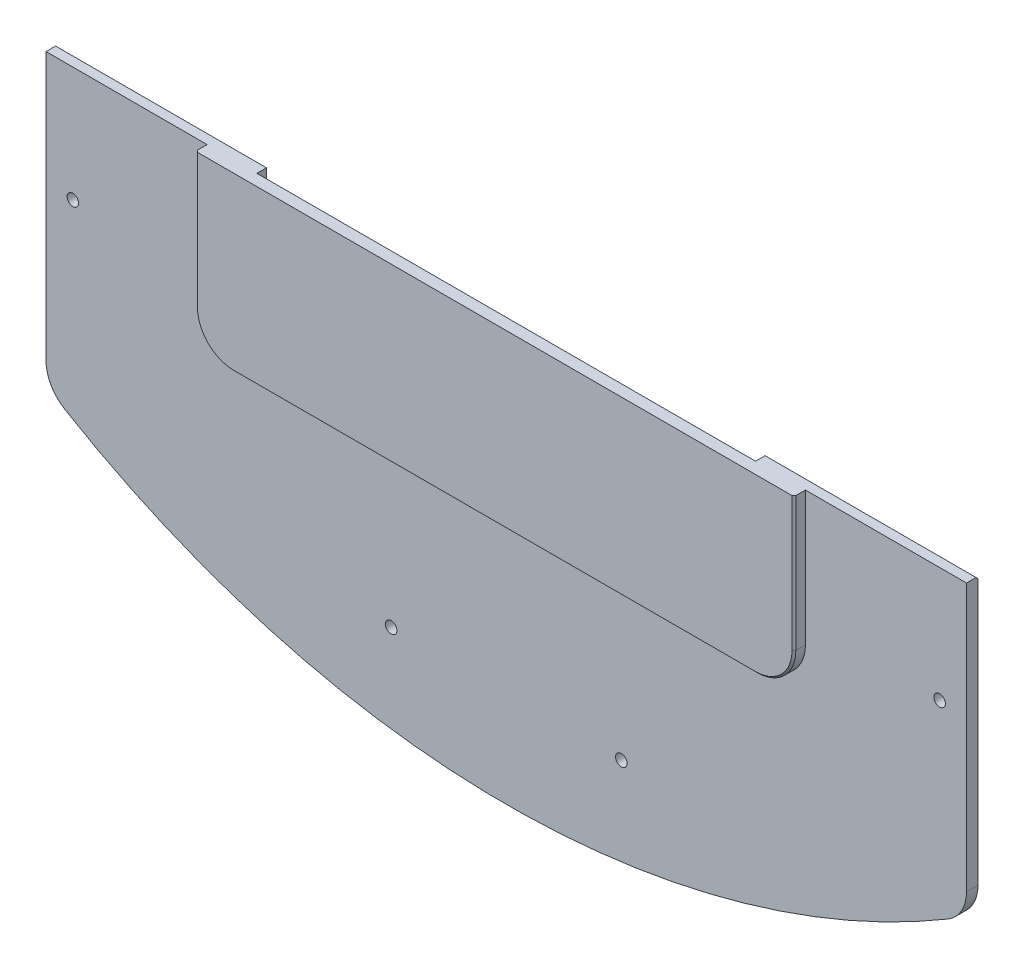
ISO-10303-21;
HEADER;
FILE_DESCRIPTION(('STEP AP214'),'2;1');
FILE_NAME('part.step','',(''),(''),'','','');
FILE_SCHEMA(('AUTOMOTIVE_DESIGN { 1 0 10303 214 1 1 1 1 }'));
ENDSEC;
DATA;
#1=APPLICATION_CONTEXT('core data for automotive mechanical design processes');
#2=APPLICATION_PROTOCOL_DEFINITION('international standard','automotive_design',2000,#1);
#3=PRODUCT_CONTEXT('',#1,'mechanical');
#4=PRODUCT('Part','Part','',(#3));
#5=PRODUCT_RELATED_PRODUCT_CATEGORY('part','',(#4));
#6=PRODUCT_DEFINITION_FORMATION('','',#4);
#7=PRODUCT_DEFINITION_CONTEXT('part definition',#1,'design');
#8=PRODUCT_DEFINITION('design','',#6,#7);
#9=PRODUCT_DEFINITION_SHAPE('','',#8);
#10=(LENGTH_UNIT() NAMED_UNIT(*) SI_UNIT(.MILLI.,.METRE.));
#11=(NAMED_UNIT(*) PLANE_ANGLE_UNIT() SI_UNIT($,.RADIAN.));
#12=(NAMED_UNIT(*) SI_UNIT($,.STERADIAN.) SOLID_ANGLE_UNIT());
#13=UNCERTAINTY_MEASURE_WITH_UNIT(LENGTH_MEASURE(1.E-05),#10,'distance_accuracy_value','');
#14=(GEOMETRIC_REPRESENTATION_CONTEXT(3) GLOBAL_UNCERTAINTY_ASSIGNED_CONTEXT((#13)) GLOBAL_UNIT_ASSIGNED_CONTEXT((#10,
#11,#12)) REPRESENTATION_CONTEXT('',''));
#15=CARTESIAN_POINT('',(0.,0.,0.));
#16=DIRECTION('',(0.,0.,1.));
#17=DIRECTION('',(1.,0.,0.));
#18=AXIS2_PLACEMENT_3D('',#15,#16,#17);
#19=CARTESIAN_POINT('',(-120.,-15.,3.));
#20=DIRECTION('',(1.,0.,0.));
#21=DIRECTION('',(0.,1.,0.));
#22=AXIS2_PLACEMENT_3D('',#19,#20,#21);
#23=PLANE('',#22);
#24=DIRECTION('',(0.,0.,-1.));
#25=VECTOR('',#24,1.);
#26=CARTESIAN_POINT('',(-120.,-15.,3.));
#27=LINE('',#26,#25);
#28=CARTESIAN_POINT('',(-120.,-15.,3.));
#29=VERTEX_POINT('',#28);
#30=CARTESIAN_POINT('',(-120.,-15.,0.499999999999973));
#31=VERTEX_POINT('',#30);
#32=EDGE_CURVE('E319',#29,#31,#27,.T.);
#33=ORIENTED_EDGE('',*,*,#32,.T.);
#34=DIRECTION('',(0.,0.707106781186548,0.707106781186548));
#35=VECTOR('',#34,1.);
#36=CARTESIAN_POINT('',(-120.,-15.,0.499999999999973));
#37=LINE('',#36,#35);
#38=CARTESIAN_POINT('',(-120.,-15.5,0.));
#39=VERTEX_POINT('',#38);
#40=EDGE_CURVE('E388',#31,#39,#37,.F.);
#41=ORIENTED_EDGE('',*,*,#40,.T.);
#42=DIRECTION('',(0.,-1.,0.));
#43=VECTOR('',#42,1.);
#44=CARTESIAN_POINT('',(-120.,-15.,0.));
#45=LINE('',#44,#43);
#46=CARTESIAN_POINT('',(-120.,-84.7295320191116,0.));
#47=VERTEX_POINT('',#46);
#48=EDGE_CURVE('E301',#39,#47,#45,.T.);
#49=ORIENTED_EDGE('',*,*,#48,.T.);
#50=DIRECTION('',(0.,0.,-1.));
#51=VECTOR('',#50,1.);
#52=CARTESIAN_POINT('',(-120.,-84.7295320191116,3.));
#53=LINE('',#52,#51);
#54=CARTESIAN_POINT('',(-120.,-84.7295320191116,3.));
#55=VERTEX_POINT('',#54);
#56=EDGE_CURVE('E360',#47,#55,#53,.F.);
#57=ORIENTED_EDGE('',*,*,#56,.T.);
#58=DIRECTION('',(0.,-1.,0.));
#59=VECTOR('',#58,1.);
#60=CARTESIAN_POINT('',(-120.,-15.,3.));
#61=LINE('',#60,#59);
#62=EDGE_CURVE('E302',#29,#55,#61,.T.);
#63=ORIENTED_EDGE('',*,*,#62,.F.);
#64=EDGE_LOOP('',(#33,#41,#49,#57,#63));
#65=FACE_BOUND('',#64,.T.);
#66=ADVANCED_FACE('F47',(#65),#23,.F.);
#67=CARTESIAN_POINT('',(0.,100.,3.));
#68=DIRECTION('',(0.,0.,-1.));
#69=DIRECTION('',(-1.,0.,0.));
#70=AXIS2_PLACEMENT_3D('',#67,#68,#69);
#71=CYLINDRICAL_SURFACE('',#70,225.);
#72=CARTESIAN_POINT('',(0.,100.,0.));
#73=DIRECTION('',(0.,0.,1.));
#74=DIRECTION('',(1.,0.,0.));
#75=AXIS2_PLACEMENT_3D('',#72,#73,#74);
#76=CIRCLE('',#75,225.);
#77=CARTESIAN_POINT('',(-115.116279069767,-93.3216032758145,0.));
#78=VERTEX_POINT('',#77);
#79=CARTESIAN_POINT('',(115.116279069767,-93.3216032758145,0.));
#80=VERTEX_POINT('',#79);
#81=EDGE_CURVE('E322',#78,#80,#76,.T.);
#82=ORIENTED_EDGE('',*,*,#81,.T.);
#83=DIRECTION('',(0.,0.,-1.));
#84=VECTOR('',#83,1.);
#85=CARTESIAN_POINT('',(115.116279069767,-93.3216032758145,3.));
#86=LINE('',#85,#84);
#87=CARTESIAN_POINT('',(115.116279069767,-93.3216032758145,3.));
#88=VERTEX_POINT('',#87);
#89=EDGE_CURVE('E351',#80,#88,#86,.F.);
#90=ORIENTED_EDGE('',*,*,#89,.T.);
#91=CARTESIAN_POINT('',(0.,100.,3.));
#92=DIRECTION('',(0.,0.,1.));
#93=DIRECTION('',(1.,0.,0.));
#94=AXIS2_PLACEMENT_3D('',#91,#92,#93);
#95=CIRCLE('',#94,225.);
#96=CARTESIAN_POINT('',(-115.116279069767,-93.3216032758145,3.));
#97=VERTEX_POINT('',#96);
#98=EDGE_CURVE('E306',#97,#88,#95,.T.);
#99=ORIENTED_EDGE('',*,*,#98,.F.);
#100=DIRECTION('',(0.,0.,-1.));
#101=VECTOR('',#100,1.);
#102=CARTESIAN_POINT('',(-115.116279069767,-93.3216032758145,3.));
#103=LINE('',#102,#101);
#104=EDGE_CURVE('E347',#97,#78,#103,.T.);
#105=ORIENTED_EDGE('',*,*,#104,.T.);
#106=EDGE_LOOP('',(#82,#90,#99,#105));
#107=FACE_BOUND('',#106,.T.);
#108=ADVANCED_FACE('F561',(#107),#71,.T.);
#109=CARTESIAN_POINT('',(120.,-15.,3.));
#110=DIRECTION('',(-1.,0.,0.));
#111=DIRECTION('',(0.,-1.,0.));
#112=AXIS2_PLACEMENT_3D('',#109,#110,#111);
#113=PLANE('',#112);
#114=DIRECTION('',(0.,1.,0.));
#115=VECTOR('',#114,1.);
#116=CARTESIAN_POINT('',(120.,-15.,0.));
#117=LINE('',#116,#115);
#118=CARTESIAN_POINT('',(120.,-84.7295320191116,0.));
#119=VERTEX_POINT('',#118);
#120=CARTESIAN_POINT('',(120.,-15.5,0.));
#121=VERTEX_POINT('',#120);
#122=EDGE_CURVE('E307',#119,#121,#117,.T.);
#123=ORIENTED_EDGE('',*,*,#122,.T.);
#124=DIRECTION('',(0.,-0.707106781186548,-0.707106781186548));
#125=VECTOR('',#124,1.);
#126=CARTESIAN_POINT('',(120.,-15.,0.499999999999995));
#127=LINE('',#126,#125);
#128=CARTESIAN_POINT('',(120.,-15.,0.499999999999973));
#129=VERTEX_POINT('',#128);
#130=EDGE_CURVE('E385',#121,#129,#127,.F.);
#131=ORIENTED_EDGE('',*,*,#130,.T.);
#132=DIRECTION('',(0.,0.,-1.));
#133=VECTOR('',#132,1.);
#134=CARTESIAN_POINT('',(120.,-15.,3.));
#135=LINE('',#134,#133);
#136=CARTESIAN_POINT('',(120.,-15.,3.));
#137=VERTEX_POINT('',#136);
#138=EDGE_CURVE('E332',#137,#129,#135,.T.);
#139=ORIENTED_EDGE('',*,*,#138,.F.);
#140=DIRECTION('',(0.,1.,0.));
#141=VECTOR('',#140,1.);
#142=CARTESIAN_POINT('',(120.,-15.,3.));
#143=LINE('',#142,#141);
#144=CARTESIAN_POINT('',(120.,-84.7295320191116,3.));
#145=VERTEX_POINT('',#144);
#146=EDGE_CURVE('E311',#145,#137,#143,.T.);
#147=ORIENTED_EDGE('',*,*,#146,.F.);
#148=DIRECTION('',(0.,0.,-1.));
#149=VECTOR('',#148,1.);
#150=CARTESIAN_POINT('',(120.,-84.7295320191116,3.));
#151=LINE('',#150,#149);
#152=EDGE_CURVE('E336',#145,#119,#151,.T.);
#153=ORIENTED_EDGE('',*,*,#152,.T.);
#154=EDGE_LOOP('',(#123,#131,#139,#147,#153));
#155=FACE_BOUND('',#154,.T.);
#156=ADVANCED_FACE('F567',(#155),#113,.F.);
#157=CARTESIAN_POINT('',(-120.,-15.,3.));
#158=DIRECTION('',(0.,-1.,0.));
#159=DIRECTION('',(0.,0.,-1.));
#160=AXIS2_PLACEMENT_3D('',#157,#158,#159);
#161=PLANE('',#160);
#162=DIRECTION('',(-1.,0.,0.));
#163=VECTOR('',#162,1.);
#164=CARTESIAN_POINT('',(-78.,-15.,6.));
#165=LINE('',#164,#163);
#166=CARTESIAN_POINT('',(77.5,-15.,6.));
#167=VERTEX_POINT('',#166);
#168=CARTESIAN_POINT('',(-77.5,-15.,6.));
#169=VERTEX_POINT('',#168);
#170=EDGE_CURVE('E280',#167,#169,#165,.T.);
#171=ORIENTED_EDGE('',*,*,#170,.F.);
#172=DIRECTION('',(0.70710678118654,0.,-0.707106781186555));
#173=VECTOR('',#172,1.);
#174=CARTESIAN_POINT('',(77.5,-15.,6.));
#175=LINE('',#174,#173);
#176=CARTESIAN_POINT('',(78.,-15.,5.49999999999999));
#177=VERTEX_POINT('',#176);
#178=EDGE_CURVE('E446',#167,#177,#175,.T.);
#179=ORIENTED_EDGE('',*,*,#178,.T.);
#180=DIRECTION('',(0.,0.,-1.));
#181=VECTOR('',#180,1.);
#182=CARTESIAN_POINT('',(78.,-15.,6.));
#183=LINE('',#182,#181);
#184=CARTESIAN_POINT('',(78.,-15.,3.));
#185=VERTEX_POINT('',#184);
#186=EDGE_CURVE('E298',#177,#185,#183,.T.);
#187=ORIENTED_EDGE('',*,*,#186,.T.);
#188=DIRECTION('',(-1.,0.,0.));
#189=VECTOR('',#188,1.);
#190=CARTESIAN_POINT('',(-120.,-15.,3.));
#191=LINE('',#190,#189);
#192=EDGE_CURVE('E315',#137,#185,#191,.T.);
#193=ORIENTED_EDGE('',*,*,#192,.F.);
#194=ORIENTED_EDGE('',*,*,#138,.T.);
#195=DIRECTION('',(-1.,0.,0.));
#196=VECTOR('',#195,1.);
#197=CARTESIAN_POINT('',(-120.,-15.,0.499999999999973));
#198=LINE('',#197,#196);
#199=CARTESIAN_POINT('',(65.,-15.,0.499999999999973));
#200=VERTEX_POINT('',#199);
#201=EDGE_CURVE('E366',#129,#200,#198,.T.);
#202=ORIENTED_EDGE('',*,*,#201,.T.);
#203=DIRECTION('',(0.,0.,-1.));
#204=VECTOR('',#203,1.);
#205=CARTESIAN_POINT('',(65.,-15.,3.));
#206=LINE('',#205,#204);
#207=CARTESIAN_POINT('',(65.,-15.,3.));
#208=VERTEX_POINT('',#207);
#209=EDGE_CURVE('E238',#208,#200,#206,.T.);
#210=ORIENTED_EDGE('',*,*,#209,.F.);
#211=DIRECTION('',(1.,0.,0.));
#212=VECTOR('',#211,1.);
#213=CARTESIAN_POINT('',(65.,-15.,3.));
#214=LINE('',#213,#212);
#215=CARTESIAN_POINT('',(-65.,-15.,3.));
#216=VERTEX_POINT('',#215);
#217=EDGE_CURVE('E211',#216,#208,#214,.T.);
#218=ORIENTED_EDGE('',*,*,#217,.F.);
#219=DIRECTION('',(0.,0.,-1.));
#220=VECTOR('',#219,1.);
#221=CARTESIAN_POINT('',(-65.,-15.,3.));
#222=LINE('',#221,#220);
#223=CARTESIAN_POINT('',(-65.,-15.,0.499999999999973));
#224=VERTEX_POINT('',#223);
#225=EDGE_CURVE('E242',#216,#224,#222,.T.);
#226=ORIENTED_EDGE('',*,*,#225,.T.);
#227=DIRECTION('',(-1.,0.,0.));
#228=VECTOR('',#227,1.);
#229=CARTESIAN_POINT('',(-120.,-15.,0.499999999999973));
#230=LINE('',#229,#228);
#231=EDGE_CURVE('E363',#224,#31,#230,.T.);
#232=ORIENTED_EDGE('',*,*,#231,.T.);
#233=ORIENTED_EDGE('',*,*,#32,.F.);
#234=CARTESIAN_POINT('',(-78.,-15.,3.));
#235=VERTEX_POINT('',#234);
#236=EDGE_CURVE('E314',#235,#29,#191,.T.);
#237=ORIENTED_EDGE('',*,*,#236,.F.);
#238=DIRECTION('',(0.,0.,-1.));
#239=VECTOR('',#238,1.);
#240=CARTESIAN_POINT('',(-78.,-15.,6.));
#241=LINE('',#240,#239);
#242=CARTESIAN_POINT('',(-78.,-15.,5.49999999999999));
#243=VERTEX_POINT('',#242);
#244=EDGE_CURVE('E284',#243,#235,#241,.T.);
#245=ORIENTED_EDGE('',*,*,#244,.F.);
#246=DIRECTION('',(0.707106781186537,0.,0.707106781186558));
#247=VECTOR('',#246,1.);
#248=CARTESIAN_POINT('',(-77.5,-15.,6.));
#249=LINE('',#248,#247);
#250=EDGE_CURVE('E443',#243,#169,#249,.T.);
#251=ORIENTED_EDGE('',*,*,#250,.T.);
#252=EDGE_LOOP('',(#171,#179,#187,#193,#194,#202,#210,#218,#226,#232,#233,#237,#245,#251));
#253=FACE_BOUND('',#252,.T.);
#254=ADVANCED_FACE('F490',(#253),#161,.F.);
#255=CARTESIAN_POINT('',(0.,100.,3.));
#256=DIRECTION('',(0.,0.,1.));
#257=DIRECTION('',(1.,0.,0.));
#258=AXIS2_PLACEMENT_3D('',#255,#256,#257);
#259=PLANE('',#258);
#260=CARTESIAN_POINT('',(30.,-100.,3.));
#261=DIRECTION('',(0.,0.,-1.));
#262=DIRECTION('',(1.,0.,0.));
#263=AXIS2_PLACEMENT_3D('',#260,#261,#262);
#264=CIRCLE('',#263,1.5);
#265=CARTESIAN_POINT('',(31.5,-100.,3.));
#266=VERTEX_POINT('',#265);
#267=EDGE_CURVE('E241',#266,#266,#264,.T.);
#268=ORIENTED_EDGE('',*,*,#267,.T.);
#269=EDGE_LOOP('',(#268));
#270=FACE_BOUND('',#269,.T.);
#271=CARTESIAN_POINT('',(113.,-45.,3.));
#272=DIRECTION('',(0.,0.,-1.));
#273=DIRECTION('',(1.,0.,0.));
#274=AXIS2_PLACEMENT_3D('',#271,#272,#273);
#275=CIRCLE('',#274,1.5);
#276=CARTESIAN_POINT('',(114.5,-45.,3.));
#277=VERTEX_POINT('',#276);
#278=EDGE_CURVE('E261',#277,#277,#275,.T.);
#279=ORIENTED_EDGE('',*,*,#278,.T.);
#280=EDGE_LOOP('',(#279));
#281=FACE_BOUND('',#280,.T.);
#282=CARTESIAN_POINT('',(-113.,-45.,3.));
#283=DIRECTION('',(0.,0.,-1.));
#284=DIRECTION('',(-1.,0.,0.));
#285=AXIS2_PLACEMENT_3D('',#282,#283,#284);
#286=CIRCLE('',#285,1.5);
#287=CARTESIAN_POINT('',(-114.5,-45.,3.));
#288=VERTEX_POINT('',#287);
#289=EDGE_CURVE('E253',#288,#288,#286,.T.);
#290=ORIENTED_EDGE('',*,*,#289,.T.);
#291=EDGE_LOOP('',(#290));
#292=FACE_BOUND('',#291,.T.);
#293=CARTESIAN_POINT('',(-30.,-100.,3.));
#294=DIRECTION('',(0.,0.,-1.));
#295=DIRECTION('',(-1.,0.,0.));
#296=AXIS2_PLACEMENT_3D('',#293,#294,#295);
#297=CIRCLE('',#296,1.50000000000002);
#298=CARTESIAN_POINT('',(-31.5,-100.,3.));
#299=VERTEX_POINT('',#298);
#300=EDGE_CURVE('E272',#299,#299,#297,.T.);
#301=ORIENTED_EDGE('',*,*,#300,.T.);
#302=EDGE_LOOP('',(#301));
#303=FACE_BOUND('',#302,.T.);
#304=ORIENTED_EDGE('',*,*,#98,.T.);
#305=CARTESIAN_POINT('',(110.,-84.7295320191116,3.));
#306=DIRECTION('',(0.,0.,1.));
#307=DIRECTION('',(1.,0.,0.));
#308=AXIS2_PLACEMENT_3D('',#305,#306,#307);
#309=CIRCLE('',#308,10.);
#310=EDGE_CURVE('E357',#88,#145,#309,.T.);
#311=ORIENTED_EDGE('',*,*,#310,.T.);
#312=ORIENTED_EDGE('',*,*,#146,.T.);
#313=ORIENTED_EDGE('',*,*,#192,.T.);
#314=DIRECTION('',(0.,1.,0.));
#315=VECTOR('',#314,1.);
#316=CARTESIAN_POINT('',(78.,-15.,3.));
#317=LINE('',#316,#315);
#318=CARTESIAN_POINT('',(78.,-50.,3.));
#319=VERTEX_POINT('',#318);
#320=EDGE_CURVE('E285',#319,#185,#317,.T.);
#321=ORIENTED_EDGE('',*,*,#320,.F.);
#322=CARTESIAN_POINT('',(68.,-50.,3.));
#323=DIRECTION('',(0.,0.,1.));
#324=DIRECTION('',(1.,0.,0.));
#325=AXIS2_PLACEMENT_3D('',#322,#323,#324);
#326=CIRCLE('',#325,10.);
#327=CARTESIAN_POINT('',(68.,-60.,3.));
#328=VERTEX_POINT('',#327);
#329=EDGE_CURVE('E424',#319,#328,#326,.F.);
#330=ORIENTED_EDGE('',*,*,#329,.T.);
#331=DIRECTION('',(1.,0.,0.));
#332=VECTOR('',#331,1.);
#333=CARTESIAN_POINT('',(-78.,-60.,3.));
#334=LINE('',#333,#332);
#335=CARTESIAN_POINT('',(-68.,-60.,3.));
#336=VERTEX_POINT('',#335);
#337=EDGE_CURVE('E289',#336,#328,#334,.T.);
#338=ORIENTED_EDGE('',*,*,#337,.F.);
#339=CARTESIAN_POINT('',(-68.,-50.,3.));
#340=DIRECTION('',(0.,0.,1.));
#341=DIRECTION('',(1.,0.,0.));
#342=AXIS2_PLACEMENT_3D('',#339,#340,#341);
#343=CIRCLE('',#342,10.);
#344=CARTESIAN_POINT('',(-78.,-50.,3.));
#345=VERTEX_POINT('',#344);
#346=EDGE_CURVE('E421',#336,#345,#343,.F.);
#347=ORIENTED_EDGE('',*,*,#346,.T.);
#348=DIRECTION('',(0.,-1.,0.));
#349=VECTOR('',#348,1.);
#350=CARTESIAN_POINT('',(-78.,-15.,3.));
#351=LINE('',#350,#349);
#352=EDGE_CURVE('E276',#235,#345,#351,.T.);
#353=ORIENTED_EDGE('',*,*,#352,.F.);
#354=ORIENTED_EDGE('',*,*,#236,.T.);
#355=ORIENTED_EDGE('',*,*,#62,.T.);
#356=CARTESIAN_POINT('',(-110.,-84.7295320191116,3.));
#357=DIRECTION('',(0.,0.,1.));
#358=DIRECTION('',(1.,0.,0.));
#359=AXIS2_PLACEMENT_3D('',#356,#357,#358);
#360=CIRCLE('',#359,10.);
#361=EDGE_CURVE('E354',#55,#97,#360,.T.);
#362=ORIENTED_EDGE('',*,*,#361,.T.);
#363=EDGE_LOOP('',(#304,#311,#312,#313,#321,#330,#338,#347,#353,#354,#355,#362));
#364=FACE_BOUND('',#363,.T.);
#365=ADVANCED_FACE('F495',(#270,#281,#292,#303,#364),#259,.T.);
#366=CARTESIAN_POINT('',(0.,100.,0.));
#367=DIRECTION('',(0.,0.,1.));
#368=DIRECTION('',(1.,0.,0.));
#369=AXIS2_PLACEMENT_3D('',#366,#367,#368);
#370=PLANE('',#369);
#371=CARTESIAN_POINT('',(30.,-100.,0.));
#372=DIRECTION('',(0.,0.,-1.));
#373=DIRECTION('',(1.,0.,0.));
#374=AXIS2_PLACEMENT_3D('',#371,#372,#373);
#375=CIRCLE('',#374,1.5);
#376=CARTESIAN_POINT('',(31.5,-100.,0.));
#377=VERTEX_POINT('',#376);
#378=EDGE_CURVE('E265',#377,#377,#375,.T.);
#379=ORIENTED_EDGE('',*,*,#378,.F.);
#380=EDGE_LOOP('',(#379));
#381=FACE_BOUND('',#380,.T.);
#382=CARTESIAN_POINT('',(113.,-45.,0.));
#383=DIRECTION('',(0.,0.,-1.));
#384=DIRECTION('',(1.,0.,0.));
#385=AXIS2_PLACEMENT_3D('',#382,#383,#384);
#386=CIRCLE('',#385,1.5);
#387=CARTESIAN_POINT('',(114.5,-45.,0.));
#388=VERTEX_POINT('',#387);
#389=EDGE_CURVE('E257',#388,#388,#386,.T.);
#390=ORIENTED_EDGE('',*,*,#389,.F.);
#391=EDGE_LOOP('',(#390));
#392=FACE_BOUND('',#391,.T.);
#393=CARTESIAN_POINT('',(-113.,-45.,0.));
#394=DIRECTION('',(0.,0.,-1.));
#395=DIRECTION('',(-1.,0.,0.));
#396=AXIS2_PLACEMENT_3D('',#393,#394,#395);
#397=CIRCLE('',#396,1.5);
#398=CARTESIAN_POINT('',(-114.5,-45.,0.));
#399=VERTEX_POINT('',#398);
#400=EDGE_CURVE('E248',#399,#399,#397,.T.);
#401=ORIENTED_EDGE('',*,*,#400,.F.);
#402=EDGE_LOOP('',(#401));
#403=FACE_BOUND('',#402,.T.);
#404=CARTESIAN_POINT('',(-30.,-100.,0.));
#405=DIRECTION('',(0.,0.,-1.));
#406=DIRECTION('',(-1.,0.,0.));
#407=AXIS2_PLACEMENT_3D('',#404,#405,#406);
#408=CIRCLE('',#407,1.50000000000002);
#409=CARTESIAN_POINT('',(-31.5,-100.,0.));
#410=VERTEX_POINT('',#409);
#411=EDGE_CURVE('E252',#410,#410,#408,.T.);
#412=ORIENTED_EDGE('',*,*,#411,.F.);
#413=EDGE_LOOP('',(#412));
#414=FACE_BOUND('',#413,.T.);
#415=DIRECTION('',(0.,1.,0.));
#416=VECTOR('',#415,1.);
#417=CARTESIAN_POINT('',(65.5,100.,0.));
#418=LINE('',#417,#416);
#419=CARTESIAN_POINT('',(65.5,-35.5,0.));
#420=VERTEX_POINT('',#419);
#421=CARTESIAN_POINT('',(65.5,-15.5,0.));
#422=VERTEX_POINT('',#421);
#423=EDGE_CURVE('E373',#420,#422,#418,.T.);
#424=ORIENTED_EDGE('',*,*,#423,.T.);
#425=DIRECTION('',(1.,0.,0.));
#426=VECTOR('',#425,1.);
#427=CARTESIAN_POINT('',(0.,-15.5,0.));
#428=LINE('',#427,#426);
#429=EDGE_CURVE('E382',#422,#121,#428,.T.);
#430=ORIENTED_EDGE('',*,*,#429,.T.);
#431=ORIENTED_EDGE('',*,*,#122,.F.);
#432=CARTESIAN_POINT('',(110.,-84.7295320191116,0.));
#433=DIRECTION('',(0.,0.,1.));
#434=DIRECTION('',(1.,0.,0.));
#435=AXIS2_PLACEMENT_3D('',#432,#433,#434);
#436=CIRCLE('',#435,10.);
#437=EDGE_CURVE('E344',#119,#80,#436,.F.);
#438=ORIENTED_EDGE('',*,*,#437,.T.);
#439=ORIENTED_EDGE('',*,*,#81,.F.);
#440=CARTESIAN_POINT('',(-110.,-84.7295320191116,0.));
#441=DIRECTION('',(0.,0.,1.));
#442=DIRECTION('',(1.,0.,0.));
#443=AXIS2_PLACEMENT_3D('',#440,#441,#442);
#444=CIRCLE('',#443,10.);
#445=EDGE_CURVE('E340',#78,#47,#444,.F.);
#446=ORIENTED_EDGE('',*,*,#445,.T.);
#447=ORIENTED_EDGE('',*,*,#48,.F.);
#448=DIRECTION('',(1.,0.,0.));
#449=VECTOR('',#448,1.);
#450=CARTESIAN_POINT('',(0.,-15.5,0.));
#451=LINE('',#450,#449);
#452=CARTESIAN_POINT('',(-65.5,-15.5,0.));
#453=VERTEX_POINT('',#452);
#454=EDGE_CURVE('E379',#39,#453,#451,.T.);
#455=ORIENTED_EDGE('',*,*,#454,.T.);
#456=DIRECTION('',(0.,-1.,0.));
#457=VECTOR('',#456,1.);
#458=CARTESIAN_POINT('',(-65.5000000000001,100.,0.));
#459=LINE('',#458,#457);
#460=CARTESIAN_POINT('',(-65.5,-35.5,0.));
#461=VERTEX_POINT('',#460);
#462=EDGE_CURVE('E376',#453,#461,#459,.T.);
#463=ORIENTED_EDGE('',*,*,#462,.T.);
#464=DIRECTION('',(1.,0.,0.));
#465=VECTOR('',#464,1.);
#466=CARTESIAN_POINT('',(0.,-35.5,0.));
#467=LINE('',#466,#465);
#468=EDGE_CURVE('E370',#461,#420,#467,.T.);
#469=ORIENTED_EDGE('',*,*,#468,.T.);
#470=EDGE_LOOP('',(#424,#430,#431,#438,#439,#446,#447,#455,#463,#469));
#471=FACE_BOUND('',#470,.T.);
#472=ADVANCED_FACE('F570',(#381,#392,#403,#414,#471),#370,.F.);
#473=CARTESIAN_POINT('',(-78.,-15.,6.));
#474=DIRECTION('',(1.,0.,0.));
#475=DIRECTION('',(0.,1.,0.));
#476=AXIS2_PLACEMENT_3D('',#473,#474,#475);
#477=PLANE('',#476);
#478=DIRECTION('',(0.,0.,-1.));
#479=VECTOR('',#478,1.);
#480=CARTESIAN_POINT('',(-78.,-50.,6.));
#481=LINE('',#480,#479);
#482=CARTESIAN_POINT('',(-78.,-50.,5.49999999999999));
#483=VERTEX_POINT('',#482);
#484=EDGE_CURVE('E415',#345,#483,#481,.F.);
#485=ORIENTED_EDGE('',*,*,#484,.T.);
#486=DIRECTION('',(0.,1.,0.));
#487=VECTOR('',#486,1.);
#488=CARTESIAN_POINT('',(-78.,-15.,5.49999999999999));
#489=LINE('',#488,#487);
#490=EDGE_CURVE('E455',#483,#243,#489,.T.);
#491=ORIENTED_EDGE('',*,*,#490,.T.);
#492=ORIENTED_EDGE('',*,*,#244,.T.);
#493=ORIENTED_EDGE('',*,*,#352,.T.);
#494=EDGE_LOOP('',(#485,#491,#492,#493));
#495=FACE_BOUND('',#494,.T.);
#496=ADVANCED_FACE('F485',(#495),#477,.F.);
#497=CARTESIAN_POINT('',(-78.,-60.,6.));
#498=DIRECTION('',(0.,1.,0.));
#499=DIRECTION('',(0.,0.,1.));
#500=AXIS2_PLACEMENT_3D('',#497,#498,#499);
#501=PLANE('',#500);
#502=DIRECTION('',(0.,0.,-1.));
#503=VECTOR('',#502,1.);
#504=CARTESIAN_POINT('',(68.,-60.,6.));
#505=LINE('',#504,#503);
#506=CARTESIAN_POINT('',(68.,-60.,5.49999999999999));
#507=VERTEX_POINT('',#506);
#508=EDGE_CURVE('E399',#328,#507,#505,.F.);
#509=ORIENTED_EDGE('',*,*,#508,.T.);
#510=DIRECTION('',(-1.,0.,0.));
#511=VECTOR('',#510,1.);
#512=CARTESIAN_POINT('',(-68.,-60.,5.49999999999999));
#513=LINE('',#512,#511);
#514=CARTESIAN_POINT('',(-68.,-60.,5.49999999999999));
#515=VERTEX_POINT('',#514);
#516=EDGE_CURVE('E58',#507,#515,#513,.T.);
#517=ORIENTED_EDGE('',*,*,#516,.T.);
#518=DIRECTION('',(0.,0.,-1.));
#519=VECTOR('',#518,1.);
#520=CARTESIAN_POINT('',(-68.,-60.,6.));
#521=LINE('',#520,#519);
#522=EDGE_CURVE('E412',#515,#336,#521,.T.);
#523=ORIENTED_EDGE('',*,*,#522,.T.);
#524=ORIENTED_EDGE('',*,*,#337,.T.);
#525=EDGE_LOOP('',(#509,#517,#523,#524));
#526=FACE_BOUND('',#525,.T.);
#527=ADVANCED_FACE('F503',(#526),#501,.F.);
#528=CARTESIAN_POINT('',(78.,-15.,6.));
#529=DIRECTION('',(-1.,0.,0.));
#530=DIRECTION('',(0.,0.,1.));
#531=AXIS2_PLACEMENT_3D('',#528,#529,#530);
#532=PLANE('',#531);
#533=ORIENTED_EDGE('',*,*,#186,.F.);
#534=DIRECTION('',(0.,-1.,0.));
#535=VECTOR('',#534,1.);
#536=CARTESIAN_POINT('',(78.,-50.,5.49999999999999));
#537=LINE('',#536,#535);
#538=CARTESIAN_POINT('',(78.,-50.,5.49999999999999));
#539=VERTEX_POINT('',#538);
#540=EDGE_CURVE('E449',#177,#539,#537,.T.);
#541=ORIENTED_EDGE('',*,*,#540,.T.);
#542=DIRECTION('',(0.,0.,-1.));
#543=VECTOR('',#542,1.);
#544=CARTESIAN_POINT('',(78.,-50.,6.));
#545=LINE('',#544,#543);
#546=EDGE_CURVE('E418',#539,#319,#545,.T.);
#547=ORIENTED_EDGE('',*,*,#546,.T.);
#548=ORIENTED_EDGE('',*,*,#320,.T.);
#549=EDGE_LOOP('',(#533,#541,#547,#548));
#550=FACE_BOUND('',#549,.T.);
#551=ADVANCED_FACE('F522',(#550),#532,.F.);
#552=CARTESIAN_POINT('',(0.,0.,6.));
#553=DIRECTION('',(0.,0.,1.));
#554=DIRECTION('',(1.,0.,0.));
#555=AXIS2_PLACEMENT_3D('',#552,#553,#554);
#556=PLANE('',#555);
#557=CARTESIAN_POINT('',(68.,-50.,6.));
#558=DIRECTION('',(0.,0.,1.));
#559=DIRECTION('',(1.,0.,0.));
#560=AXIS2_PLACEMENT_3D('',#557,#558,#559);
#561=CIRCLE('',#560,9.49999999999999);
#562=CARTESIAN_POINT('',(68.,-59.5,6.));
#563=VERTEX_POINT('',#562);
#564=CARTESIAN_POINT('',(77.5,-50.,6.));
#565=VERTEX_POINT('',#564);
#566=EDGE_CURVE('E436',#563,#565,#561,.T.);
#567=ORIENTED_EDGE('',*,*,#566,.T.);
#568=DIRECTION('',(0.,1.,0.));
#569=VECTOR('',#568,1.);
#570=CARTESIAN_POINT('',(77.5,-15.,6.));
#571=LINE('',#570,#569);
#572=EDGE_CURVE('E439',#565,#167,#571,.T.);
#573=ORIENTED_EDGE('',*,*,#572,.T.);
#574=ORIENTED_EDGE('',*,*,#170,.T.);
#575=DIRECTION('',(0.,-1.,0.));
#576=VECTOR('',#575,1.);
#577=CARTESIAN_POINT('',(-77.5,-50.,6.));
#578=LINE('',#577,#576);
#579=CARTESIAN_POINT('',(-77.5,-50.,6.));
#580=VERTEX_POINT('',#579);
#581=EDGE_CURVE('E433',#169,#580,#578,.T.);
#582=ORIENTED_EDGE('',*,*,#581,.T.);
#583=CARTESIAN_POINT('',(-68.,-50.,6.));
#584=DIRECTION('',(0.,0.,1.));
#585=DIRECTION('',(1.,0.,0.));
#586=AXIS2_PLACEMENT_3D('',#583,#584,#585);
#587=CIRCLE('',#586,9.50000000000001);
#588=CARTESIAN_POINT('',(-68.,-59.5,6.));
#589=VERTEX_POINT('',#588);
#590=EDGE_CURVE('E427',#580,#589,#587,.T.);
#591=ORIENTED_EDGE('',*,*,#590,.T.);
#592=DIRECTION('',(1.,0.,0.));
#593=VECTOR('',#592,1.);
#594=CARTESIAN_POINT('',(68.,-59.5,6.));
#595=LINE('',#594,#593);
#596=EDGE_CURVE('E430',#589,#563,#595,.T.);
#597=ORIENTED_EDGE('',*,*,#596,.T.);
#598=EDGE_LOOP('',(#567,#573,#574,#582,#591,#597));
#599=FACE_BOUND('',#598,.T.);
#600=ADVANCED_FACE('F518',(#599),#556,.T.);
#601=CARTESIAN_POINT('',(-30.,-100.,3.));
#602=DIRECTION('',(0.,0.,-1.));
#603=DIRECTION('',(-1.,0.,0.));
#604=AXIS2_PLACEMENT_3D('',#601,#602,#603);
#605=CYLINDRICAL_SURFACE('',#604,1.50000000000002);
#606=ORIENTED_EDGE('',*,*,#300,.F.);
#607=EDGE_LOOP('',(#606));
#608=FACE_BOUND('',#607,.T.);
#609=ORIENTED_EDGE('',*,*,#411,.T.);
#610=EDGE_LOOP('',(#609));
#611=FACE_BOUND('',#610,.T.);
#612=ADVANCED_FACE('F669',(#608,#611),#605,.F.);
#613=CARTESIAN_POINT('',(-113.,-45.,3.));
#614=DIRECTION('',(0.,0.,-1.));
#615=DIRECTION('',(-1.,0.,0.));
#616=AXIS2_PLACEMENT_3D('',#613,#614,#615);
#617=CYLINDRICAL_SURFACE('',#616,1.5);
#618=ORIENTED_EDGE('',*,*,#289,.F.);
#619=EDGE_LOOP('',(#618));
#620=FACE_BOUND('',#619,.T.);
#621=ORIENTED_EDGE('',*,*,#400,.T.);
#622=EDGE_LOOP('',(#621));
#623=FACE_BOUND('',#622,.T.);
#624=ADVANCED_FACE('F769',(#620,#623),#617,.F.);
#625=CARTESIAN_POINT('',(113.,-45.,3.));
#626=DIRECTION('',(0.,0.,-1.));
#627=DIRECTION('',(-1.,0.,0.));
#628=AXIS2_PLACEMENT_3D('',#625,#626,#627);
#629=CYLINDRICAL_SURFACE('',#628,1.5);
#630=ORIENTED_EDGE('',*,*,#278,.F.);
#631=EDGE_LOOP('',(#630));
#632=FACE_BOUND('',#631,.T.);
#633=ORIENTED_EDGE('',*,*,#389,.T.);
#634=EDGE_LOOP('',(#633));
#635=FACE_BOUND('',#634,.T.);
#636=ADVANCED_FACE('F758',(#632,#635),#629,.F.);
#637=CARTESIAN_POINT('',(30.,-100.,3.));
#638=DIRECTION('',(0.,0.,-1.));
#639=DIRECTION('',(-1.,0.,0.));
#640=AXIS2_PLACEMENT_3D('',#637,#638,#639);
#641=CYLINDRICAL_SURFACE('',#640,1.5);
#642=ORIENTED_EDGE('',*,*,#267,.F.);
#643=EDGE_LOOP('',(#642));
#644=FACE_BOUND('',#643,.T.);
#645=ORIENTED_EDGE('',*,*,#378,.T.);
#646=EDGE_LOOP('',(#645));
#647=FACE_BOUND('',#646,.T.);
#648=ADVANCED_FACE('F746',(#644,#647),#641,.F.);
#649=CARTESIAN_POINT('',(65.,-15.,3.));
#650=DIRECTION('',(1.,0.,0.));
#651=DIRECTION('',(0.,0.,-1.));
#652=AXIS2_PLACEMENT_3D('',#649,#650,#651);
#653=PLANE('',#652);
#654=ORIENTED_EDGE('',*,*,#209,.T.);
#655=DIRECTION('',(0.,-1.,0.));
#656=VECTOR('',#655,1.);
#657=CARTESIAN_POINT('',(65.,-15.,0.499999999999973));
#658=LINE('',#657,#656);
#659=CARTESIAN_POINT('',(65.,-35.,0.499999999999973));
#660=VERTEX_POINT('',#659);
#661=EDGE_CURVE('E206',#200,#660,#658,.T.);
#662=ORIENTED_EDGE('',*,*,#661,.T.);
#663=DIRECTION('',(0.,0.,-1.));
#664=VECTOR('',#663,1.);
#665=CARTESIAN_POINT('',(65.,-35.,3.));
#666=LINE('',#665,#664);
#667=CARTESIAN_POINT('',(65.,-35.,3.));
#668=VERTEX_POINT('',#667);
#669=EDGE_CURVE('E198',#668,#660,#666,.T.);
#670=ORIENTED_EDGE('',*,*,#669,.F.);
#671=DIRECTION('',(0.,-1.,0.));
#672=VECTOR('',#671,1.);
#673=CARTESIAN_POINT('',(65.,-15.,3.));
#674=LINE('',#673,#672);
#675=EDGE_CURVE('E203',#208,#668,#674,.T.);
#676=ORIENTED_EDGE('',*,*,#675,.F.);
#677=EDGE_LOOP('',(#654,#662,#670,#676));
#678=FACE_BOUND('',#677,.T.);
#679=ADVANCED_FACE('F201',(#678),#653,.F.);
#680=CARTESIAN_POINT('',(-65.,-15.,3.));
#681=DIRECTION('',(-1.,0.,0.));
#682=DIRECTION('',(0.,-1.,0.));
#683=AXIS2_PLACEMENT_3D('',#680,#681,#682);
#684=PLANE('',#683);
#685=DIRECTION('',(0.,0.,-1.));
#686=VECTOR('',#685,1.);
#687=CARTESIAN_POINT('',(-65.,-35.,3.));
#688=LINE('',#687,#686);
#689=CARTESIAN_POINT('',(-65.,-35.,3.));
#690=VERTEX_POINT('',#689);
#691=CARTESIAN_POINT('',(-65.,-35.,0.499999999999973));
#692=VERTEX_POINT('',#691);
#693=EDGE_CURVE('E210',#690,#692,#688,.T.);
#694=ORIENTED_EDGE('',*,*,#693,.T.);
#695=DIRECTION('',(0.,1.,0.));
#696=VECTOR('',#695,1.);
#697=CARTESIAN_POINT('',(-65.,-15.,0.499999999999973));
#698=LINE('',#697,#696);
#699=EDGE_CURVE('E391',#692,#224,#698,.T.);
#700=ORIENTED_EDGE('',*,*,#699,.T.);
#701=ORIENTED_EDGE('',*,*,#225,.F.);
#702=DIRECTION('',(0.,1.,0.));
#703=VECTOR('',#702,1.);
#704=CARTESIAN_POINT('',(-65.,-15.,3.));
#705=LINE('',#704,#703);
#706=EDGE_CURVE('E221',#690,#216,#705,.T.);
#707=ORIENTED_EDGE('',*,*,#706,.F.);
#708=EDGE_LOOP('',(#694,#700,#701,#707));
#709=FACE_BOUND('',#708,.T.);
#710=ADVANCED_FACE('F542',(#709),#684,.F.);
#711=CARTESIAN_POINT('',(65.,-35.,3.));
#712=DIRECTION('',(0.,-1.,0.));
#713=DIRECTION('',(0.,0.,-1.));
#714=AXIS2_PLACEMENT_3D('',#711,#712,#713);
#715=PLANE('',#714);
#716=ORIENTED_EDGE('',*,*,#669,.T.);
#717=DIRECTION('',(-1.,0.,0.));
#718=VECTOR('',#717,1.);
#719=CARTESIAN_POINT('',(65.,-35.,0.499999999999973));
#720=LINE('',#719,#718);
#721=EDGE_CURVE('E396',#660,#692,#720,.T.);
#722=ORIENTED_EDGE('',*,*,#721,.T.);
#723=ORIENTED_EDGE('',*,*,#693,.F.);
#724=DIRECTION('',(-1.,0.,0.));
#725=VECTOR('',#724,1.);
#726=CARTESIAN_POINT('',(65.,-35.,3.));
#727=LINE('',#726,#725);
#728=EDGE_CURVE('E214',#668,#690,#727,.T.);
#729=ORIENTED_EDGE('',*,*,#728,.F.);
#730=EDGE_LOOP('',(#716,#722,#723,#729));
#731=FACE_BOUND('',#730,.T.);
#732=ADVANCED_FACE('F215',(#731),#715,.F.);
#733=CARTESIAN_POINT('',(0.,0.,3.));
#734=DIRECTION('',(0.,0.,-1.));
#735=DIRECTION('',(-1.,0.,0.));
#736=AXIS2_PLACEMENT_3D('',#733,#734,#735);
#737=PLANE('',#736);
#738=ORIENTED_EDGE('',*,*,#675,.T.);
#739=ORIENTED_EDGE('',*,*,#728,.T.);
#740=ORIENTED_EDGE('',*,*,#706,.T.);
#741=ORIENTED_EDGE('',*,*,#217,.T.);
#742=EDGE_LOOP('',(#738,#739,#740,#741));
#743=FACE_BOUND('',#742,.T.);
#744=ADVANCED_FACE('F223',(#743),#737,.T.);
#745=CARTESIAN_POINT('',(110.,-84.7295320191116,3.));
#746=DIRECTION('',(0.,0.,-1.));
#747=DIRECTION('',(-1.,0.,0.));
#748=AXIS2_PLACEMENT_3D('',#745,#746,#747);
#749=CYLINDRICAL_SURFACE('',#748,10.);
#750=ORIENTED_EDGE('',*,*,#310,.F.);
#751=ORIENTED_EDGE('',*,*,#89,.F.);
#752=ORIENTED_EDGE('',*,*,#437,.F.);
#753=ORIENTED_EDGE('',*,*,#152,.F.);
#754=EDGE_LOOP('',(#750,#751,#752,#753));
#755=FACE_BOUND('',#754,.T.);
#756=ADVANCED_FACE('F565',(#755),#749,.T.);
#757=CARTESIAN_POINT('',(-110.,-84.7295320191116,3.));
#758=DIRECTION('',(0.,0.,-1.));
#759=DIRECTION('',(-1.,0.,0.));
#760=AXIS2_PLACEMENT_3D('',#757,#758,#759);
#761=CYLINDRICAL_SURFACE('',#760,10.);
#762=ORIENTED_EDGE('',*,*,#361,.F.);
#763=ORIENTED_EDGE('',*,*,#56,.F.);
#764=ORIENTED_EDGE('',*,*,#445,.F.);
#765=ORIENTED_EDGE('',*,*,#104,.F.);
#766=EDGE_LOOP('',(#762,#763,#764,#765));
#767=FACE_BOUND('',#766,.T.);
#768=ADVANCED_FACE('F556',(#767),#761,.T.);
#769=CARTESIAN_POINT('',(-120.,-15.,0.499999999999973));
#770=DIRECTION('',(0.,-0.707106781186547,0.707106781186547));
#771=DIRECTION('',(-1.,0.,0.));
#772=AXIS2_PLACEMENT_3D('',#769,#770,#771);
#773=PLANE('',#772);
#774=ORIENTED_EDGE('',*,*,#40,.F.);
#775=ORIENTED_EDGE('',*,*,#231,.F.);
#776=DIRECTION('',(0.577350269189617,0.57735026918963,0.57735026918963));
#777=VECTOR('',#776,1.);
#778=CARTESIAN_POINT('',(-65.,-15.,0.499999999999973));
#779=LINE('',#778,#777);
#780=EDGE_CURVE('E227',#453,#224,#779,.T.);
#781=ORIENTED_EDGE('',*,*,#780,.F.);
#782=ORIENTED_EDGE('',*,*,#454,.F.);
#783=EDGE_LOOP('',(#774,#775,#781,#782));
#784=FACE_BOUND('',#783,.T.);
#785=ADVANCED_FACE('F551',(#784),#773,.F.);
#786=CARTESIAN_POINT('',(-65.,-15.,0.499999999999973));
#787=DIRECTION('',(-0.707106781186555,0.,0.70710678118654));
#788=DIRECTION('',(0.,1.,0.));
#789=AXIS2_PLACEMENT_3D('',#786,#787,#788);
#790=PLANE('',#789);
#791=ORIENTED_EDGE('',*,*,#780,.T.);
#792=ORIENTED_EDGE('',*,*,#699,.F.);
#793=DIRECTION('',(0.577350269189617,0.57735026918963,0.57735026918963));
#794=VECTOR('',#793,1.);
#795=CARTESIAN_POINT('',(-58.3333333333334,-28.3333333333332,7.16666666666673));
#796=LINE('',#795,#794);
#797=EDGE_CURVE('E231',#461,#692,#796,.T.);
#798=ORIENTED_EDGE('',*,*,#797,.F.);
#799=ORIENTED_EDGE('',*,*,#462,.F.);
#800=EDGE_LOOP('',(#791,#792,#798,#799));
#801=FACE_BOUND('',#800,.T.);
#802=ADVANCED_FACE('F544',(#801),#790,.F.);
#803=CARTESIAN_POINT('',(65.,-35.,0.499999999999973));
#804=DIRECTION('',(0.,-0.707106781186547,0.707106781186547));
#805=DIRECTION('',(-1.,0.,0.));
#806=AXIS2_PLACEMENT_3D('',#803,#804,#805);
#807=PLANE('',#806);
#808=ORIENTED_EDGE('',*,*,#797,.T.);
#809=ORIENTED_EDGE('',*,*,#721,.F.);
#810=DIRECTION('',(0.577350269189626,-0.577350269189626,-0.577350269189626));
#811=VECTOR('',#810,1.);
#812=CARTESIAN_POINT('',(58.3333333333333,-28.3333333333333,7.16666666666664));
#813=LINE('',#812,#811);
#814=EDGE_CURVE('E403',#420,#660,#813,.F.);
#815=ORIENTED_EDGE('',*,*,#814,.F.);
#816=ORIENTED_EDGE('',*,*,#468,.F.);
#817=EDGE_LOOP('',(#808,#809,#815,#816));
#818=FACE_BOUND('',#817,.T.);
#819=ADVANCED_FACE('F538',(#818),#807,.F.);
#820=CARTESIAN_POINT('',(65.,-15.,0.499999999999973));
#821=DIRECTION('',(0.707106781186547,0.,0.707106781186547));
#822=DIRECTION('',(0.,-1.,0.));
#823=AXIS2_PLACEMENT_3D('',#820,#821,#822);
#824=PLANE('',#823);
#825=ORIENTED_EDGE('',*,*,#814,.T.);
#826=ORIENTED_EDGE('',*,*,#661,.F.);
#827=DIRECTION('',(0.577350269189626,-0.577350269189626,-0.577350269189626));
#828=VECTOR('',#827,1.);
#829=CARTESIAN_POINT('',(65.,-15.,0.499999999999973));
#830=LINE('',#829,#828);
#831=EDGE_CURVE('E400',#422,#200,#830,.F.);
#832=ORIENTED_EDGE('',*,*,#831,.F.);
#833=ORIENTED_EDGE('',*,*,#423,.F.);
#834=EDGE_LOOP('',(#825,#826,#832,#833));
#835=FACE_BOUND('',#834,.T.);
#836=ADVANCED_FACE('F534',(#835),#824,.F.);
#837=CARTESIAN_POINT('',(-120.,-15.,0.499999999999973));
#838=DIRECTION('',(0.,-0.707106781186547,0.707106781186547));
#839=DIRECTION('',(-1.,0.,0.));
#840=AXIS2_PLACEMENT_3D('',#837,#838,#839);
#841=PLANE('',#840);
#842=ORIENTED_EDGE('',*,*,#130,.F.);
#843=ORIENTED_EDGE('',*,*,#429,.F.);
#844=ORIENTED_EDGE('',*,*,#831,.T.);
#845=ORIENTED_EDGE('',*,*,#201,.F.);
#846=EDGE_LOOP('',(#842,#843,#844,#845));
#847=FACE_BOUND('',#846,.T.);
#848=ADVANCED_FACE('F529',(#847),#841,.F.);
#849=CARTESIAN_POINT('',(-68.,-50.,6.));
#850=DIRECTION('',(0.,0.,-1.));
#851=DIRECTION('',(-1.,0.,0.));
#852=AXIS2_PLACEMENT_3D('',#849,#850,#851);
#853=CYLINDRICAL_SURFACE('',#852,10.);
#854=ORIENTED_EDGE('',*,*,#522,.F.);
#855=CARTESIAN_POINT('',(-68.,-50.,5.49999999999999));
#856=DIRECTION('',(0.,0.,1.));
#857=DIRECTION('',(1.,0.,0.));
#858=AXIS2_PLACEMENT_3D('',#855,#856,#857);
#859=CIRCLE('',#858,10.);
#860=EDGE_CURVE('E11',#515,#483,#859,.F.);
#861=ORIENTED_EDGE('',*,*,#860,.T.);
#862=ORIENTED_EDGE('',*,*,#484,.F.);
#863=ORIENTED_EDGE('',*,*,#346,.F.);
#864=EDGE_LOOP('',(#854,#861,#862,#863));
#865=FACE_BOUND('',#864,.T.);
#866=ADVANCED_FACE('F499',(#865),#853,.T.);
#867=CARTESIAN_POINT('',(68.,-50.,6.));
#868=DIRECTION('',(0.,0.,-1.));
#869=DIRECTION('',(-1.,0.,0.));
#870=AXIS2_PLACEMENT_3D('',#867,#868,#869);
#871=CYLINDRICAL_SURFACE('',#870,10.);
#872=ORIENTED_EDGE('',*,*,#546,.F.);
#873=CARTESIAN_POINT('',(68.,-50.,5.49999999999999));
#874=DIRECTION('',(0.,0.,1.));
#875=DIRECTION('',(1.,0.,0.));
#876=AXIS2_PLACEMENT_3D('',#873,#874,#875);
#877=CIRCLE('',#876,10.);
#878=EDGE_CURVE('E452',#539,#507,#877,.F.);
#879=ORIENTED_EDGE('',*,*,#878,.T.);
#880=ORIENTED_EDGE('',*,*,#508,.F.);
#881=ORIENTED_EDGE('',*,*,#329,.F.);
#882=EDGE_LOOP('',(#872,#879,#880,#881));
#883=FACE_BOUND('',#882,.T.);
#884=ADVANCED_FACE('F506',(#883),#871,.T.);
#885=CARTESIAN_POINT('',(-77.5,0.,6.));
#886=DIRECTION('',(-0.707106781186558,0.,0.707106781186537));
#887=DIRECTION('',(0.,1.,0.));
#888=AXIS2_PLACEMENT_3D('',#885,#886,#887);
#889=PLANE('',#888);
#890=ORIENTED_EDGE('',*,*,#250,.F.);
#891=ORIENTED_EDGE('',*,*,#490,.F.);
#892=DIRECTION('',(-0.70710678118653,0.,-0.707106781186565));
#893=VECTOR('',#892,1.);
#894=CARTESIAN_POINT('',(-77.5,-50.,6.));
#895=LINE('',#894,#893);
#896=EDGE_CURVE('E52',#580,#483,#895,.T.);
#897=ORIENTED_EDGE('',*,*,#896,.F.);
#898=ORIENTED_EDGE('',*,*,#581,.F.);
#899=EDGE_LOOP('',(#890,#891,#897,#898));
#900=FACE_BOUND('',#899,.T.);
#901=ADVANCED_FACE('F50',(#900),#889,.T.);
#902=CARTESIAN_POINT('',(-68.,-50.,6.));
#903=DIRECTION('',(0.,0.,-1.));
#904=DIRECTION('',(-1.,0.,0.));
#905=AXIS2_PLACEMENT_3D('',#902,#903,#904);
#906=CONICAL_SURFACE('',#905,9.50000000000001,0.785398163397429);
#907=ORIENTED_EDGE('',*,*,#896,.T.);
#908=ORIENTED_EDGE('',*,*,#860,.F.);
#909=DIRECTION('',(0.,-0.707106781186535,-0.70710678118656));
#910=VECTOR('',#909,1.);
#911=CARTESIAN_POINT('',(-68.,-59.5,6.));
#912=LINE('',#911,#910);
#913=EDGE_CURVE('E467',#589,#515,#912,.T.);
#914=ORIENTED_EDGE('',*,*,#913,.F.);
#915=ORIENTED_EDGE('',*,*,#590,.F.);
#916=EDGE_LOOP('',(#907,#908,#914,#915));
#917=FACE_BOUND('',#916,.T.);
#918=ADVANCED_FACE('F478',(#917),#906,.T.);
#919=CARTESIAN_POINT('',(0.,-59.5,6.));
#920=DIRECTION('',(0.,-0.707106781186555,0.70710678118654));
#921=DIRECTION('',(-1.,0.,0.));
#922=AXIS2_PLACEMENT_3D('',#919,#920,#921);
#923=PLANE('',#922);
#924=ORIENTED_EDGE('',*,*,#913,.T.);
#925=ORIENTED_EDGE('',*,*,#516,.F.);
#926=DIRECTION('',(0.,-0.70710678118654,-0.707106781186555));
#927=VECTOR('',#926,1.);
#928=CARTESIAN_POINT('',(68.,-59.5,6.));
#929=LINE('',#928,#927);
#930=EDGE_CURVE('E464',#563,#507,#929,.T.);
#931=ORIENTED_EDGE('',*,*,#930,.F.);
#932=ORIENTED_EDGE('',*,*,#596,.F.);
#933=EDGE_LOOP('',(#924,#925,#931,#932));
#934=FACE_BOUND('',#933,.T.);
#935=ADVANCED_FACE('F638',(#934),#923,.T.);
#936=CARTESIAN_POINT('',(68.,-50.,6.));
#937=DIRECTION('',(0.,0.,-1.));
#938=DIRECTION('',(-1.,0.,0.));
#939=AXIS2_PLACEMENT_3D('',#936,#937,#938);
#940=CONICAL_SURFACE('',#939,9.5,0.785398163397436);
#941=ORIENTED_EDGE('',*,*,#930,.T.);
#942=ORIENTED_EDGE('',*,*,#878,.F.);
#943=DIRECTION('',(0.70710678118654,0.,-0.707106781186555));
#944=VECTOR('',#943,1.);
#945=CARTESIAN_POINT('',(77.5,-50.,6.));
#946=LINE('',#945,#944);
#947=EDGE_CURVE('E460',#565,#539,#946,.T.);
#948=ORIENTED_EDGE('',*,*,#947,.F.);
#949=ORIENTED_EDGE('',*,*,#566,.F.);
#950=EDGE_LOOP('',(#941,#942,#948,#949));
#951=FACE_BOUND('',#950,.T.);
#952=ADVANCED_FACE('F510',(#951),#940,.T.);
#953=CARTESIAN_POINT('',(77.5,0.,6.));
#954=DIRECTION('',(0.707106781186555,0.,0.70710678118654));
#955=DIRECTION('',(0.,-1.,0.));
#956=AXIS2_PLACEMENT_3D('',#953,#954,#955);
#957=PLANE('',#956);
#958=ORIENTED_EDGE('',*,*,#947,.T.);
#959=ORIENTED_EDGE('',*,*,#540,.F.);
#960=ORIENTED_EDGE('',*,*,#178,.F.);
#961=ORIENTED_EDGE('',*,*,#572,.F.);
#962=EDGE_LOOP('',(#958,#959,#960,#961));
#963=FACE_BOUND('',#962,.T.);
#964=ADVANCED_FACE('F516',(#963),#957,.T.);
#965=CLOSED_SHELL('',(#66,#108,#156,#254,#365,#472,#496,#527,#551,#600,#612,#624,#636,#648,#679,
#710,#732,#744,#756,#768,#785,#802,#819,#836,#848,#866,#884,#901,#918,#935,#952,#964));
#966=MANIFOLD_SOLID_BREP('B2',#965);
#967=ADVANCED_BREP_SHAPE_REPRESENTATION('',(#18,#966),#14);
#968=SHAPE_DEFINITION_REPRESENTATION(#9,#967);
ENDSEC;
END-ISO-10303-21;
